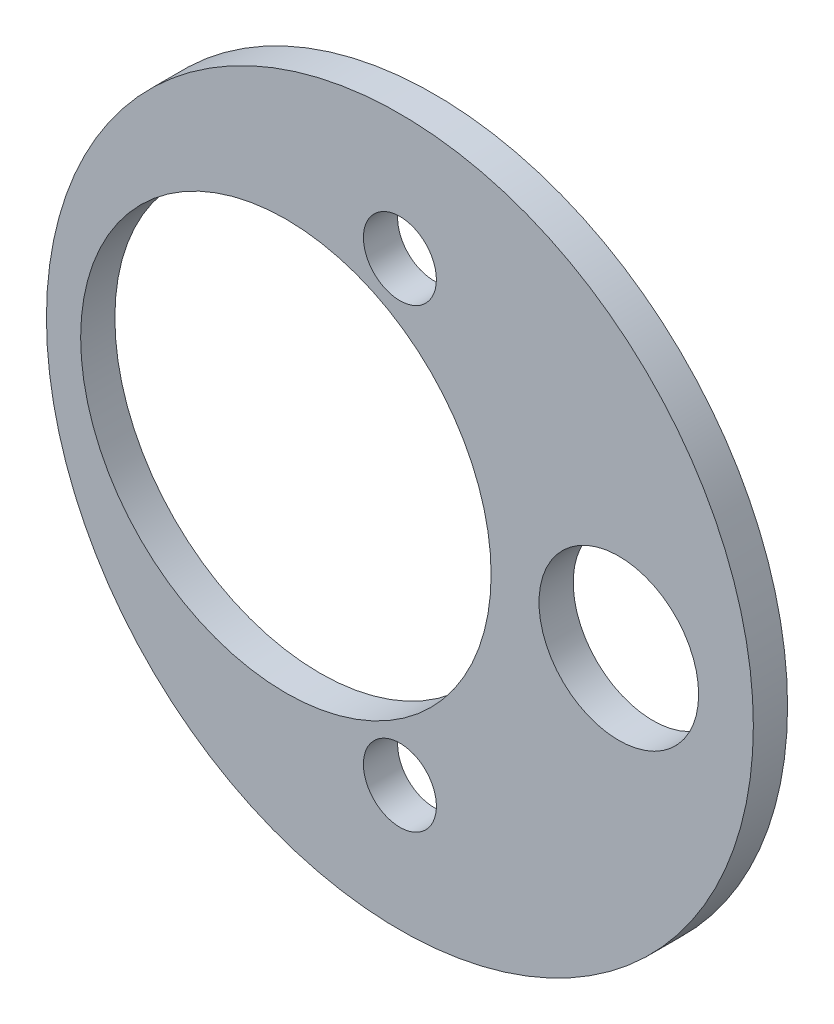
ISO-10303-21;
HEADER;
FILE_DESCRIPTION(('STEP AP214'),'2;1');
FILE_NAME('part.step','',(''),(''),'','','');
FILE_SCHEMA(('AUTOMOTIVE_DESIGN { 1 0 10303 214 1 1 1 1 }'));
ENDSEC;
DATA;
#1=APPLICATION_CONTEXT('core data for automotive mechanical design processes');
#2=APPLICATION_PROTOCOL_DEFINITION('international standard','automotive_design',2000,#1);
#3=PRODUCT_CONTEXT('',#1,'mechanical');
#4=PRODUCT('Part','Part','',(#3));
#5=PRODUCT_RELATED_PRODUCT_CATEGORY('part','',(#4));
#6=PRODUCT_DEFINITION_FORMATION('','',#4);
#7=PRODUCT_DEFINITION_CONTEXT('part definition',#1,'design');
#8=PRODUCT_DEFINITION('design','',#6,#7);
#9=PRODUCT_DEFINITION_SHAPE('','',#8);
#10=(LENGTH_UNIT() NAMED_UNIT(*) SI_UNIT(.MILLI.,.METRE.));
#11=(NAMED_UNIT(*) PLANE_ANGLE_UNIT() SI_UNIT($,.RADIAN.));
#12=(NAMED_UNIT(*) SI_UNIT($,.STERADIAN.) SOLID_ANGLE_UNIT());
#13=UNCERTAINTY_MEASURE_WITH_UNIT(LENGTH_MEASURE(1.E-05),#10,'distance_accuracy_value','');
#14=(GEOMETRIC_REPRESENTATION_CONTEXT(3) GLOBAL_UNCERTAINTY_ASSIGNED_CONTEXT((#13)) GLOBAL_UNIT_ASSIGNED_CONTEXT((#10,
#11,#12)) REPRESENTATION_CONTEXT('',''));
#15=CARTESIAN_POINT('',(0.,0.,0.));
#16=DIRECTION('',(0.,0.,1.));
#17=DIRECTION('',(1.,0.,0.));
#18=AXIS2_PLACEMENT_3D('',#15,#16,#17);
#19=CARTESIAN_POINT('',(0.,0.,1.5));
#20=DIRECTION('',(0.,0.,1.));
#21=DIRECTION('',(1.,0.,0.));
#22=AXIS2_PLACEMENT_3D('',#19,#20,#21);
#23=PLANE('',#22);
#24=CARTESIAN_POINT('',(0.,10.,1.5));
#25=DIRECTION('',(0.,0.,1.));
#26=DIRECTION('',(1.,0.,0.));
#27=AXIS2_PLACEMENT_3D('',#24,#25,#26);
#28=CIRCLE('',#27,1.6);
#29=CARTESIAN_POINT('',(1.6,10.,1.5));
#30=VERTEX_POINT('',#29);
#31=EDGE_CURVE('E54',#30,#30,#28,.T.);
#32=ORIENTED_EDGE('',*,*,#31,.F.);
#33=EDGE_LOOP('',(#32));
#34=FACE_BOUND('',#33,.T.);
#35=CARTESIAN_POINT('',(-5.,0.,1.5));
#36=DIRECTION('',(0.,0.,1.));
#37=DIRECTION('',(1.,0.,0.));
#38=AXIS2_PLACEMENT_3D('',#35,#36,#37);
#39=CIRCLE('',#38,9.);
#40=CARTESIAN_POINT('',(4.,0.,1.5));
#41=VERTEX_POINT('',#40);
#42=EDGE_CURVE('E43',#41,#41,#39,.T.);
#43=ORIENTED_EDGE('',*,*,#42,.F.);
#44=EDGE_LOOP('',(#43));
#45=FACE_BOUND('',#44,.T.);
#46=CARTESIAN_POINT('',(0.,0.,1.5));
#47=DIRECTION('',(0.,0.,1.));
#48=DIRECTION('',(1.,0.,0.));
#49=AXIS2_PLACEMENT_3D('',#46,#47,#48);
#50=CIRCLE('',#49,15.5);
#51=CARTESIAN_POINT('',(15.5,0.,1.5));
#52=VERTEX_POINT('',#51);
#53=EDGE_CURVE('E10',#52,#52,#50,.T.);
#54=ORIENTED_EDGE('',*,*,#53,.T.);
#55=EDGE_LOOP('',(#54));
#56=FACE_BOUND('',#55,.T.);
#57=CARTESIAN_POINT('',(9.6,0.,1.5));
#58=DIRECTION('',(0.,0.,1.));
#59=DIRECTION('',(1.,0.,0.));
#60=AXIS2_PLACEMENT_3D('',#57,#58,#59);
#61=CIRCLE('',#60,3.5);
#62=CARTESIAN_POINT('',(13.1,0.,1.5));
#63=VERTEX_POINT('',#62);
#64=EDGE_CURVE('E48',#63,#63,#61,.T.);
#65=ORIENTED_EDGE('',*,*,#64,.F.);
#66=EDGE_LOOP('',(#65));
#67=FACE_BOUND('',#66,.T.);
#68=CARTESIAN_POINT('',(0.,-10.,1.5));
#69=DIRECTION('',(0.,0.,1.));
#70=DIRECTION('',(-1.,0.,0.));
#71=AXIS2_PLACEMENT_3D('',#68,#69,#70);
#72=CIRCLE('',#71,1.6);
#73=CARTESIAN_POINT('',(-1.6,-10.,1.5));
#74=VERTEX_POINT('',#73);
#75=EDGE_CURVE('E60',#74,#74,#72,.T.);
#76=ORIENTED_EDGE('',*,*,#75,.F.);
#77=EDGE_LOOP('',(#76));
#78=FACE_BOUND('',#77,.T.);
#79=ADVANCED_FACE('F32',(#34,#45,#56,#67,#78),#23,.T.);
#80=CARTESIAN_POINT('',(0.,0.,0.));
#81=DIRECTION('',(0.,0.,1.));
#82=DIRECTION('',(1.,0.,0.));
#83=AXIS2_PLACEMENT_3D('',#80,#81,#82);
#84=PLANE('',#83);
#85=CARTESIAN_POINT('',(0.,0.,0.));
#86=DIRECTION('',(0.,0.,1.));
#87=DIRECTION('',(1.,0.,0.));
#88=AXIS2_PLACEMENT_3D('',#85,#86,#87);
#89=CIRCLE('',#88,15.5);
#90=CARTESIAN_POINT('',(15.5,0.,0.));
#91=VERTEX_POINT('',#90);
#92=EDGE_CURVE('E36',#91,#91,#89,.T.);
#93=ORIENTED_EDGE('',*,*,#92,.F.);
#94=EDGE_LOOP('',(#93));
#95=FACE_BOUND('',#94,.T.);
#96=CARTESIAN_POINT('',(-5.,0.,0.));
#97=DIRECTION('',(0.,0.,1.));
#98=DIRECTION('',(1.,0.,0.));
#99=AXIS2_PLACEMENT_3D('',#96,#97,#98);
#100=CIRCLE('',#99,9.);
#101=CARTESIAN_POINT('',(4.,0.,0.));
#102=VERTEX_POINT('',#101);
#103=EDGE_CURVE('E45',#102,#102,#100,.T.);
#104=ORIENTED_EDGE('',*,*,#103,.T.);
#105=EDGE_LOOP('',(#104));
#106=FACE_BOUND('',#105,.T.);
#107=CARTESIAN_POINT('',(9.6,0.,0.));
#108=DIRECTION('',(0.,0.,1.));
#109=DIRECTION('',(1.,0.,0.));
#110=AXIS2_PLACEMENT_3D('',#107,#108,#109);
#111=CIRCLE('',#110,3.5);
#112=CARTESIAN_POINT('',(13.1,0.,0.));
#113=VERTEX_POINT('',#112);
#114=EDGE_CURVE('E51',#113,#113,#111,.T.);
#115=ORIENTED_EDGE('',*,*,#114,.T.);
#116=EDGE_LOOP('',(#115));
#117=FACE_BOUND('',#116,.T.);
#118=CARTESIAN_POINT('',(0.,10.,0.));
#119=DIRECTION('',(0.,0.,1.));
#120=DIRECTION('',(1.,0.,0.));
#121=AXIS2_PLACEMENT_3D('',#118,#119,#120);
#122=CIRCLE('',#121,1.6);
#123=CARTESIAN_POINT('',(1.6,10.,0.));
#124=VERTEX_POINT('',#123);
#125=EDGE_CURVE('E57',#124,#124,#122,.T.);
#126=ORIENTED_EDGE('',*,*,#125,.T.);
#127=EDGE_LOOP('',(#126));
#128=FACE_BOUND('',#127,.T.);
#129=CARTESIAN_POINT('',(0.,-10.,0.));
#130=DIRECTION('',(0.,0.,1.));
#131=DIRECTION('',(-1.,0.,0.));
#132=AXIS2_PLACEMENT_3D('',#129,#130,#131);
#133=CIRCLE('',#132,1.6);
#134=CARTESIAN_POINT('',(-1.6,-10.,0.));
#135=VERTEX_POINT('',#134);
#136=EDGE_CURVE('E63',#135,#135,#133,.T.);
#137=ORIENTED_EDGE('',*,*,#136,.T.);
#138=EDGE_LOOP('',(#137));
#139=FACE_BOUND('',#138,.T.);
#140=ADVANCED_FACE('F73',(#95,#106,#117,#128,#139),#84,.F.);
#141=CARTESIAN_POINT('',(0.,0.,1.5));
#142=DIRECTION('',(0.,0.,-1.));
#143=DIRECTION('',(-1.,0.,0.));
#144=AXIS2_PLACEMENT_3D('',#141,#142,#143);
#145=CYLINDRICAL_SURFACE('',#144,15.5);
#146=ORIENTED_EDGE('',*,*,#53,.F.);
#147=EDGE_LOOP('',(#146));
#148=FACE_BOUND('',#147,.T.);
#149=ORIENTED_EDGE('',*,*,#92,.T.);
#150=EDGE_LOOP('',(#149));
#151=FACE_BOUND('',#150,.T.);
#152=ADVANCED_FACE('F34',(#148,#151),#145,.T.);
#153=CARTESIAN_POINT('',(-5.,0.,1.5));
#154=DIRECTION('',(0.,0.,-1.));
#155=DIRECTION('',(-1.,0.,0.));
#156=AXIS2_PLACEMENT_3D('',#153,#154,#155);
#157=CYLINDRICAL_SURFACE('',#156,9.);
#158=ORIENTED_EDGE('',*,*,#42,.T.);
#159=EDGE_LOOP('',(#158));
#160=FACE_BOUND('',#159,.T.);
#161=ORIENTED_EDGE('',*,*,#103,.F.);
#162=EDGE_LOOP('',(#161));
#163=FACE_BOUND('',#162,.T.);
#164=ADVANCED_FACE('F83',(#160,#163),#157,.F.);
#165=CARTESIAN_POINT('',(9.6,0.,1.5));
#166=DIRECTION('',(0.,0.,-1.));
#167=DIRECTION('',(-1.,0.,0.));
#168=AXIS2_PLACEMENT_3D('',#165,#166,#167);
#169=CYLINDRICAL_SURFACE('',#168,3.5);
#170=ORIENTED_EDGE('',*,*,#64,.T.);
#171=EDGE_LOOP('',(#170));
#172=FACE_BOUND('',#171,.T.);
#173=ORIENTED_EDGE('',*,*,#114,.F.);
#174=EDGE_LOOP('',(#173));
#175=FACE_BOUND('',#174,.T.);
#176=ADVANCED_FACE('F86',(#172,#175),#169,.F.);
#177=CARTESIAN_POINT('',(0.,10.,1.5));
#178=DIRECTION('',(0.,0.,-1.));
#179=DIRECTION('',(-1.,0.,0.));
#180=AXIS2_PLACEMENT_3D('',#177,#178,#179);
#181=CYLINDRICAL_SURFACE('',#180,1.6);
#182=ORIENTED_EDGE('',*,*,#31,.T.);
#183=EDGE_LOOP('',(#182));
#184=FACE_BOUND('',#183,.T.);
#185=ORIENTED_EDGE('',*,*,#125,.F.);
#186=EDGE_LOOP('',(#185));
#187=FACE_BOUND('',#186,.T.);
#188=ADVANCED_FACE('F90',(#184,#187),#181,.F.);
#189=CARTESIAN_POINT('',(0.,-10.,1.5));
#190=DIRECTION('',(0.,0.,-1.));
#191=DIRECTION('',(-1.,0.,0.));
#192=AXIS2_PLACEMENT_3D('',#189,#190,#191);
#193=CYLINDRICAL_SURFACE('',#192,1.6);
#194=ORIENTED_EDGE('',*,*,#75,.T.);
#195=EDGE_LOOP('',(#194));
#196=FACE_BOUND('',#195,.T.);
#197=ORIENTED_EDGE('',*,*,#136,.F.);
#198=EDGE_LOOP('',(#197));
#199=FACE_BOUND('',#198,.T.);
#200=ADVANCED_FACE('F69',(#196,#199),#193,.F.);
#201=CLOSED_SHELL('',(#79,#140,#152,#164,#176,#188,#200));
#202=MANIFOLD_SOLID_BREP('B2',#201);
#203=ADVANCED_BREP_SHAPE_REPRESENTATION('',(#18,#202),#14);
#204=SHAPE_DEFINITION_REPRESENTATION(#9,#203);
ENDSEC;
END-ISO-10303-21;
